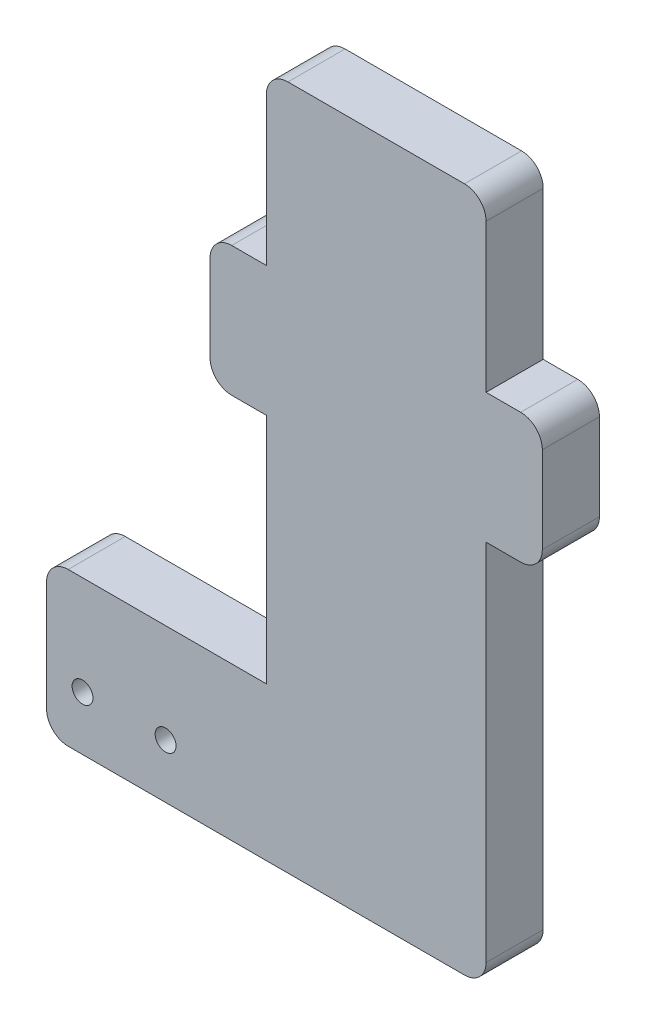
ISO-10303-21;
HEADER;
FILE_DESCRIPTION(('STEP AP214'),'2;1');
FILE_NAME('part.step','',(''),(''),'','','');
FILE_SCHEMA(('AUTOMOTIVE_DESIGN { 1 0 10303 214 1 1 1 1 }'));
ENDSEC;
DATA;
#1=APPLICATION_CONTEXT('core data for automotive mechanical design processes');
#2=APPLICATION_PROTOCOL_DEFINITION('international standard','automotive_design',2000,#1);
#3=PRODUCT_CONTEXT('',#1,'mechanical');
#4=PRODUCT('Part','Part','',(#3));
#5=PRODUCT_RELATED_PRODUCT_CATEGORY('part','',(#4));
#6=PRODUCT_DEFINITION_FORMATION('','',#4);
#7=PRODUCT_DEFINITION_CONTEXT('part definition',#1,'design');
#8=PRODUCT_DEFINITION('design','',#6,#7);
#9=PRODUCT_DEFINITION_SHAPE('','',#8);
#10=(LENGTH_UNIT() NAMED_UNIT(*) SI_UNIT(.MILLI.,.METRE.));
#11=(NAMED_UNIT(*) PLANE_ANGLE_UNIT() SI_UNIT($,.RADIAN.));
#12=(NAMED_UNIT(*) SI_UNIT($,.STERADIAN.) SOLID_ANGLE_UNIT());
#13=UNCERTAINTY_MEASURE_WITH_UNIT(LENGTH_MEASURE(1.E-05),#10,'distance_accuracy_value','');
#14=(GEOMETRIC_REPRESENTATION_CONTEXT(3) GLOBAL_UNCERTAINTY_ASSIGNED_CONTEXT((#13)) GLOBAL_UNIT_ASSIGNED_CONTEXT((#10,
#11,#12)) REPRESENTATION_CONTEXT('',''));
#15=CARTESIAN_POINT('',(0.,0.,0.));
#16=DIRECTION('',(0.,0.,1.));
#17=DIRECTION('',(1.,0.,0.));
#18=AXIS2_PLACEMENT_3D('',#15,#16,#17);
#19=CARTESIAN_POINT('',(-35.6,-45.95,6.6));
#20=DIRECTION('',(0.,0.,1.));
#21=DIRECTION('',(1.,0.,0.));
#22=AXIS2_PLACEMENT_3D('',#19,#20,#21);
#23=PLANE('',#22);
#24=CARTESIAN_POINT('',(-33.9438,-42.1983,6.6));
#25=DIRECTION('',(0.,0.,1.));
#26=DIRECTION('',(1.,0.,0.));
#27=AXIS2_PLACEMENT_3D('',#24,#25,#26);
#28=CIRCLE('',#27,1.20650000000003);
#29=CARTESIAN_POINT('',(-32.7373,-42.1983,6.6));
#30=VERTEX_POINT('',#29);
#31=EDGE_CURVE('E224',#30,#30,#28,.T.);
#32=ORIENTED_EDGE('',*,*,#31,.F.);
#33=EDGE_LOOP('',(#32));
#34=FACE_BOUND('',#33,.T.);
#35=CARTESIAN_POINT('',(-35.6,-45.95,6.6));
#36=DIRECTION('',(0.,0.,1.));
#37=DIRECTION('',(1.,0.,0.));
#38=AXIS2_PLACEMENT_3D('',#35,#36,#37);
#39=CIRCLE('',#38,2.50000000000001);
#40=CARTESIAN_POINT('',(-38.1,-45.95,6.6));
#41=VERTEX_POINT('',#40);
#42=CARTESIAN_POINT('',(-35.6,-48.45,6.6));
#43=VERTEX_POINT('',#42);
#44=EDGE_CURVE('E265',#41,#43,#39,.T.);
#45=ORIENTED_EDGE('',*,*,#44,.T.);
#46=DIRECTION('',(1.,0.,0.));
#47=VECTOR('',#46,1.);
#48=CARTESIAN_POINT('',(-35.6,-48.45,6.6));
#49=LINE('',#48,#47);
#50=CARTESIAN_POINT('',(10.2,-48.45,6.6));
#51=VERTEX_POINT('',#50);
#52=EDGE_CURVE('E138',#43,#51,#49,.T.);
#53=ORIENTED_EDGE('',*,*,#52,.T.);
#54=CARTESIAN_POINT('',(10.2,-45.95,6.6));
#55=DIRECTION('',(0.,0.,1.));
#56=DIRECTION('',(1.,0.,0.));
#57=AXIS2_PLACEMENT_3D('',#54,#55,#56);
#58=CIRCLE('',#57,2.50000000000002);
#59=CARTESIAN_POINT('',(12.7,-45.95,6.6));
#60=VERTEX_POINT('',#59);
#61=EDGE_CURVE('E325',#51,#60,#58,.T.);
#62=ORIENTED_EDGE('',*,*,#61,.T.);
#63=DIRECTION('',(0.,1.,0.));
#64=VECTOR('',#63,1.);
#65=CARTESIAN_POINT('',(12.7,-45.95,6.6));
#66=LINE('',#65,#64);
#67=CARTESIAN_POINT('',(12.7,-3.87,6.6));
#68=VERTEX_POINT('',#67);
#69=EDGE_CURVE('E344',#60,#68,#66,.T.);
#70=ORIENTED_EDGE('',*,*,#69,.T.);
#71=DIRECTION('',(1.,0.,0.));
#72=VECTOR('',#71,1.);
#73=CARTESIAN_POINT('',(16.7,-3.87,6.6));
#74=LINE('',#73,#72);
#75=CARTESIAN_POINT('',(16.7,-3.87,6.6));
#76=VERTEX_POINT('',#75);
#77=EDGE_CURVE('E341',#68,#76,#74,.T.);
#78=ORIENTED_EDGE('',*,*,#77,.T.);
#79=CARTESIAN_POINT('',(16.7,-1.37,6.6));
#80=DIRECTION('',(0.,0.,1.));
#81=DIRECTION('',(1.,0.,0.));
#82=AXIS2_PLACEMENT_3D('',#79,#80,#81);
#83=CIRCLE('',#82,2.5);
#84=CARTESIAN_POINT('',(19.2,-1.37,6.6));
#85=VERTEX_POINT('',#84);
#86=EDGE_CURVE('E343',#76,#85,#83,.T.);
#87=ORIENTED_EDGE('',*,*,#86,.T.);
#88=DIRECTION('',(0.,1.,0.));
#89=VECTOR('',#88,1.);
#90=CARTESIAN_POINT('',(19.2,8.63,6.6));
#91=LINE('',#90,#89);
#92=CARTESIAN_POINT('',(19.2,8.63,6.6));
#93=VERTEX_POINT('',#92);
#94=EDGE_CURVE('E346',#85,#93,#91,.T.);
#95=ORIENTED_EDGE('',*,*,#94,.T.);
#96=CARTESIAN_POINT('',(16.7,8.63,6.6));
#97=DIRECTION('',(0.,0.,1.));
#98=DIRECTION('',(1.,0.,0.));
#99=AXIS2_PLACEMENT_3D('',#96,#97,#98);
#100=CIRCLE('',#99,2.5);
#101=CARTESIAN_POINT('',(16.7,11.13,6.6));
#102=VERTEX_POINT('',#101);
#103=EDGE_CURVE('E352',#93,#102,#100,.T.);
#104=ORIENTED_EDGE('',*,*,#103,.T.);
#105=DIRECTION('',(-1.,0.,0.));
#106=VECTOR('',#105,1.);
#107=CARTESIAN_POINT('',(12.7,11.13,6.6));
#108=LINE('',#107,#106);
#109=CARTESIAN_POINT('',(12.7,11.13,6.6));
#110=VERTEX_POINT('',#109);
#111=EDGE_CURVE('E354',#102,#110,#108,.T.);
#112=ORIENTED_EDGE('',*,*,#111,.T.);
#113=DIRECTION('',(0.,1.,0.));
#114=VECTOR('',#113,1.);
#115=CARTESIAN_POINT('',(12.7,11.13,6.6));
#116=LINE('',#115,#114);
#117=CARTESIAN_POINT('',(12.7,28.25,6.6));
#118=VERTEX_POINT('',#117);
#119=EDGE_CURVE('E356',#110,#118,#116,.T.);
#120=ORIENTED_EDGE('',*,*,#119,.T.);
#121=CARTESIAN_POINT('',(10.2,28.25,6.6));
#122=DIRECTION('',(0.,0.,1.));
#123=DIRECTION('',(1.,0.,0.));
#124=AXIS2_PLACEMENT_3D('',#121,#122,#123);
#125=CIRCLE('',#124,2.50000000000001);
#126=CARTESIAN_POINT('',(10.2,30.75,6.6));
#127=VERTEX_POINT('',#126);
#128=EDGE_CURVE('E358',#118,#127,#125,.T.);
#129=ORIENTED_EDGE('',*,*,#128,.T.);
#130=DIRECTION('',(-1.,0.,0.));
#131=VECTOR('',#130,1.);
#132=CARTESIAN_POINT('',(10.2,30.75,6.6));
#133=LINE('',#132,#131);
#134=CARTESIAN_POINT('',(-10.2,30.75,6.6));
#135=VERTEX_POINT('',#134);
#136=EDGE_CURVE('E360',#127,#135,#133,.T.);
#137=ORIENTED_EDGE('',*,*,#136,.T.);
#138=CARTESIAN_POINT('',(-10.2,28.25,6.6));
#139=DIRECTION('',(0.,0.,1.));
#140=DIRECTION('',(1.,0.,0.));
#141=AXIS2_PLACEMENT_3D('',#138,#139,#140);
#142=CIRCLE('',#141,2.5);
#143=CARTESIAN_POINT('',(-12.7,28.25,6.6));
#144=VERTEX_POINT('',#143);
#145=EDGE_CURVE('E362',#135,#144,#142,.T.);
#146=ORIENTED_EDGE('',*,*,#145,.T.);
#147=DIRECTION('',(0.,-1.,0.));
#148=VECTOR('',#147,1.);
#149=CARTESIAN_POINT('',(-12.7,28.25,6.6));
#150=LINE('',#149,#148);
#151=CARTESIAN_POINT('',(-12.7,11.13,6.6));
#152=VERTEX_POINT('',#151);
#153=EDGE_CURVE('E364',#144,#152,#150,.T.);
#154=ORIENTED_EDGE('',*,*,#153,.T.);
#155=DIRECTION('',(-1.,0.,0.));
#156=VECTOR('',#155,1.);
#157=CARTESIAN_POINT('',(-12.7,11.13,6.6));
#158=LINE('',#157,#156);
#159=CARTESIAN_POINT('',(-16.7,11.13,6.6));
#160=VERTEX_POINT('',#159);
#161=EDGE_CURVE('E366',#152,#160,#158,.T.);
#162=ORIENTED_EDGE('',*,*,#161,.T.);
#163=CARTESIAN_POINT('',(-16.7,8.63,6.6));
#164=DIRECTION('',(0.,0.,1.));
#165=DIRECTION('',(1.,0.,0.));
#166=AXIS2_PLACEMENT_3D('',#163,#164,#165);
#167=CIRCLE('',#166,2.5);
#168=CARTESIAN_POINT('',(-19.2,8.63,6.6));
#169=VERTEX_POINT('',#168);
#170=EDGE_CURVE('E368',#160,#169,#167,.T.);
#171=ORIENTED_EDGE('',*,*,#170,.T.);
#172=DIRECTION('',(0.,-1.,0.));
#173=VECTOR('',#172,1.);
#174=CARTESIAN_POINT('',(-19.2,8.63,6.6));
#175=LINE('',#174,#173);
#176=CARTESIAN_POINT('',(-19.2,-1.37,6.6));
#177=VERTEX_POINT('',#176);
#178=EDGE_CURVE('E370',#169,#177,#175,.T.);
#179=ORIENTED_EDGE('',*,*,#178,.T.);
#180=CARTESIAN_POINT('',(-16.7,-1.36999999999999,6.6));
#181=DIRECTION('',(0.,0.,1.));
#182=DIRECTION('',(1.,0.,0.));
#183=AXIS2_PLACEMENT_3D('',#180,#181,#182);
#184=CIRCLE('',#183,2.50000000000001);
#185=CARTESIAN_POINT('',(-16.7,-3.87,6.6));
#186=VERTEX_POINT('',#185);
#187=EDGE_CURVE('E372',#177,#186,#184,.T.);
#188=ORIENTED_EDGE('',*,*,#187,.T.);
#189=DIRECTION('',(1.,0.,0.));
#190=VECTOR('',#189,1.);
#191=CARTESIAN_POINT('',(-16.7,-3.87,6.6));
#192=LINE('',#191,#190);
#193=CARTESIAN_POINT('',(-12.7,-3.87,6.6));
#194=VERTEX_POINT('',#193);
#195=EDGE_CURVE('E374',#186,#194,#192,.T.);
#196=ORIENTED_EDGE('',*,*,#195,.T.);
#197=DIRECTION('',(0.,-1.,0.));
#198=VECTOR('',#197,1.);
#199=CARTESIAN_POINT('',(-12.7,-3.87,6.6));
#200=LINE('',#199,#198);
#201=CARTESIAN_POINT('',(-12.7,-30.75,6.6));
#202=VERTEX_POINT('',#201);
#203=EDGE_CURVE('E202',#194,#202,#200,.T.);
#204=ORIENTED_EDGE('',*,*,#203,.T.);
#205=DIRECTION('',(-1.,0.,0.));
#206=VECTOR('',#205,1.);
#207=CARTESIAN_POINT('',(-12.7,-30.75,6.6));
#208=LINE('',#207,#206);
#209=CARTESIAN_POINT('',(-35.6,-30.75,6.6));
#210=VERTEX_POINT('',#209);
#211=EDGE_CURVE('E196',#202,#210,#208,.T.);
#212=ORIENTED_EDGE('',*,*,#211,.T.);
#213=CARTESIAN_POINT('',(-35.6,-33.25,6.6));
#214=DIRECTION('',(0.,0.,1.));
#215=DIRECTION('',(1.,0.,0.));
#216=AXIS2_PLACEMENT_3D('',#213,#214,#215);
#217=CIRCLE('',#216,2.5);
#218=CARTESIAN_POINT('',(-38.1,-33.25,6.6));
#219=VERTEX_POINT('',#218);
#220=EDGE_CURVE('E200',#210,#219,#217,.T.);
#221=ORIENTED_EDGE('',*,*,#220,.T.);
#222=DIRECTION('',(0.,-1.,0.));
#223=VECTOR('',#222,1.);
#224=CARTESIAN_POINT('',(-38.1,-33.25,6.6));
#225=LINE('',#224,#223);
#226=EDGE_CURVE('E50',#219,#41,#225,.T.);
#227=ORIENTED_EDGE('',*,*,#226,.T.);
#228=EDGE_LOOP('',(#45,#53,#62,#70,#78,#87,#95,#104,#112,#120,#129,#137,#146,#154,#162,#171,
#179,#188,#196,#204,#212,#221,#227));
#229=FACE_BOUND('',#228,.T.);
#230=CARTESIAN_POINT('',(-24.3426,-42.1983,6.6));
#231=DIRECTION('',(0.,0.,1.));
#232=DIRECTION('',(1.,0.,0.));
#233=AXIS2_PLACEMENT_3D('',#230,#231,#232);
#234=CIRCLE('',#233,1.20650000000002);
#235=CARTESIAN_POINT('',(-23.1361,-42.1983,6.6));
#236=VERTEX_POINT('',#235);
#237=EDGE_CURVE('E417',#236,#236,#234,.T.);
#238=ORIENTED_EDGE('',*,*,#237,.F.);
#239=EDGE_LOOP('',(#238));
#240=FACE_BOUND('',#239,.T.);
#241=ADVANCED_FACE('F33',(#34,#229,#240),#23,.T.);
#242=CARTESIAN_POINT('',(-35.6,-45.95,0.));
#243=DIRECTION('',(0.,0.,1.));
#244=DIRECTION('',(1.,0.,0.));
#245=AXIS2_PLACEMENT_3D('',#242,#243,#244);
#246=PLANE('',#245);
#247=CARTESIAN_POINT('',(-33.9438,-42.1983,0.));
#248=DIRECTION('',(0.,0.,1.));
#249=DIRECTION('',(1.,0.,0.));
#250=AXIS2_PLACEMENT_3D('',#247,#248,#249);
#251=CIRCLE('',#250,1.20650000000003);
#252=CARTESIAN_POINT('',(-32.7373,-42.1983,0.));
#253=VERTEX_POINT('',#252);
#254=EDGE_CURVE('E422',#253,#253,#251,.T.);
#255=ORIENTED_EDGE('',*,*,#254,.T.);
#256=EDGE_LOOP('',(#255));
#257=FACE_BOUND('',#256,.T.);
#258=CARTESIAN_POINT('',(-35.6,-45.95,0.));
#259=DIRECTION('',(0.,0.,1.));
#260=DIRECTION('',(1.,0.,0.));
#261=AXIS2_PLACEMENT_3D('',#258,#259,#260);
#262=CIRCLE('',#261,2.50000000000001);
#263=CARTESIAN_POINT('',(-38.1,-45.95,0.));
#264=VERTEX_POINT('',#263);
#265=CARTESIAN_POINT('',(-35.6,-48.45,0.));
#266=VERTEX_POINT('',#265);
#267=EDGE_CURVE('E220',#264,#266,#262,.T.);
#268=ORIENTED_EDGE('',*,*,#267,.F.);
#269=DIRECTION('',(0.,-1.,0.));
#270=VECTOR('',#269,1.);
#271=CARTESIAN_POINT('',(-38.1,-33.25,0.));
#272=LINE('',#271,#270);
#273=CARTESIAN_POINT('',(-38.1,-33.25,0.));
#274=VERTEX_POINT('',#273);
#275=EDGE_CURVE('E130',#274,#264,#272,.T.);
#276=ORIENTED_EDGE('',*,*,#275,.F.);
#277=CARTESIAN_POINT('',(-35.6,-33.25,0.));
#278=DIRECTION('',(0.,0.,1.));
#279=DIRECTION('',(1.,0.,0.));
#280=AXIS2_PLACEMENT_3D('',#277,#278,#279);
#281=CIRCLE('',#280,2.5);
#282=CARTESIAN_POINT('',(-35.6,-30.75,0.));
#283=VERTEX_POINT('',#282);
#284=EDGE_CURVE('E124',#283,#274,#281,.T.);
#285=ORIENTED_EDGE('',*,*,#284,.F.);
#286=DIRECTION('',(-1.,0.,0.));
#287=VECTOR('',#286,1.);
#288=CARTESIAN_POINT('',(-12.7,-30.75,0.));
#289=LINE('',#288,#287);
#290=CARTESIAN_POINT('',(-12.7,-30.75,0.));
#291=VERTEX_POINT('',#290);
#292=EDGE_CURVE('E210',#291,#283,#289,.T.);
#293=ORIENTED_EDGE('',*,*,#292,.F.);
#294=DIRECTION('',(0.,-1.,0.));
#295=VECTOR('',#294,1.);
#296=CARTESIAN_POINT('',(-12.7,-3.87,0.));
#297=LINE('',#296,#295);
#298=CARTESIAN_POINT('',(-12.7,-3.87,0.));
#299=VERTEX_POINT('',#298);
#300=EDGE_CURVE('E260',#299,#291,#297,.T.);
#301=ORIENTED_EDGE('',*,*,#300,.F.);
#302=DIRECTION('',(1.,0.,0.));
#303=VECTOR('',#302,1.);
#304=CARTESIAN_POINT('',(-16.7,-3.87,0.));
#305=LINE('',#304,#303);
#306=CARTESIAN_POINT('',(-16.7,-3.87,0.));
#307=VERTEX_POINT('',#306);
#308=EDGE_CURVE('E258',#307,#299,#305,.T.);
#309=ORIENTED_EDGE('',*,*,#308,.F.);
#310=CARTESIAN_POINT('',(-16.7,-1.36999999999999,0.));
#311=DIRECTION('',(0.,0.,1.));
#312=DIRECTION('',(1.,0.,0.));
#313=AXIS2_PLACEMENT_3D('',#310,#311,#312);
#314=CIRCLE('',#313,2.50000000000001);
#315=CARTESIAN_POINT('',(-19.2,-1.37,0.));
#316=VERTEX_POINT('',#315);
#317=EDGE_CURVE('E256',#316,#307,#314,.T.);
#318=ORIENTED_EDGE('',*,*,#317,.F.);
#319=DIRECTION('',(0.,-1.,0.));
#320=VECTOR('',#319,1.);
#321=CARTESIAN_POINT('',(-19.2,8.63,0.));
#322=LINE('',#321,#320);
#323=CARTESIAN_POINT('',(-19.2,8.63,0.));
#324=VERTEX_POINT('',#323);
#325=EDGE_CURVE('E254',#324,#316,#322,.T.);
#326=ORIENTED_EDGE('',*,*,#325,.F.);
#327=CARTESIAN_POINT('',(-16.7,8.63,0.));
#328=DIRECTION('',(0.,0.,1.));
#329=DIRECTION('',(1.,0.,0.));
#330=AXIS2_PLACEMENT_3D('',#327,#328,#329);
#331=CIRCLE('',#330,2.5);
#332=CARTESIAN_POINT('',(-16.7,11.13,0.));
#333=VERTEX_POINT('',#332);
#334=EDGE_CURVE('E252',#333,#324,#331,.T.);
#335=ORIENTED_EDGE('',*,*,#334,.F.);
#336=DIRECTION('',(-1.,0.,0.));
#337=VECTOR('',#336,1.);
#338=CARTESIAN_POINT('',(-12.7,11.13,0.));
#339=LINE('',#338,#337);
#340=CARTESIAN_POINT('',(-12.7,11.13,0.));
#341=VERTEX_POINT('',#340);
#342=EDGE_CURVE('E250',#341,#333,#339,.T.);
#343=ORIENTED_EDGE('',*,*,#342,.F.);
#344=DIRECTION('',(0.,-1.,0.));
#345=VECTOR('',#344,1.);
#346=CARTESIAN_POINT('',(-12.7,28.25,0.));
#347=LINE('',#346,#345);
#348=CARTESIAN_POINT('',(-12.7,28.25,0.));
#349=VERTEX_POINT('',#348);
#350=EDGE_CURVE('E248',#349,#341,#347,.T.);
#351=ORIENTED_EDGE('',*,*,#350,.F.);
#352=CARTESIAN_POINT('',(-10.2,28.25,0.));
#353=DIRECTION('',(0.,0.,1.));
#354=DIRECTION('',(1.,0.,0.));
#355=AXIS2_PLACEMENT_3D('',#352,#353,#354);
#356=CIRCLE('',#355,2.5);
#357=CARTESIAN_POINT('',(-10.2,30.75,0.));
#358=VERTEX_POINT('',#357);
#359=EDGE_CURVE('E246',#358,#349,#356,.T.);
#360=ORIENTED_EDGE('',*,*,#359,.F.);
#361=DIRECTION('',(-1.,0.,0.));
#362=VECTOR('',#361,1.);
#363=CARTESIAN_POINT('',(10.2,30.75,0.));
#364=LINE('',#363,#362);
#365=CARTESIAN_POINT('',(10.2,30.75,0.));
#366=VERTEX_POINT('',#365);
#367=EDGE_CURVE('E244',#366,#358,#364,.T.);
#368=ORIENTED_EDGE('',*,*,#367,.F.);
#369=CARTESIAN_POINT('',(10.2,28.25,0.));
#370=DIRECTION('',(0.,0.,1.));
#371=DIRECTION('',(1.,0.,0.));
#372=AXIS2_PLACEMENT_3D('',#369,#370,#371);
#373=CIRCLE('',#372,2.50000000000001);
#374=CARTESIAN_POINT('',(12.7,28.25,0.));
#375=VERTEX_POINT('',#374);
#376=EDGE_CURVE('E242',#375,#366,#373,.T.);
#377=ORIENTED_EDGE('',*,*,#376,.F.);
#378=DIRECTION('',(0.,1.,0.));
#379=VECTOR('',#378,1.);
#380=CARTESIAN_POINT('',(12.7,11.13,0.));
#381=LINE('',#380,#379);
#382=CARTESIAN_POINT('',(12.7,11.13,0.));
#383=VERTEX_POINT('',#382);
#384=EDGE_CURVE('E240',#383,#375,#381,.T.);
#385=ORIENTED_EDGE('',*,*,#384,.F.);
#386=DIRECTION('',(-1.,0.,0.));
#387=VECTOR('',#386,1.);
#388=CARTESIAN_POINT('',(12.7,11.13,0.));
#389=LINE('',#388,#387);
#390=CARTESIAN_POINT('',(16.7,11.13,0.));
#391=VERTEX_POINT('',#390);
#392=EDGE_CURVE('E238',#391,#383,#389,.T.);
#393=ORIENTED_EDGE('',*,*,#392,.F.);
#394=CARTESIAN_POINT('',(16.7,8.63,0.));
#395=DIRECTION('',(0.,0.,1.));
#396=DIRECTION('',(1.,0.,0.));
#397=AXIS2_PLACEMENT_3D('',#394,#395,#396);
#398=CIRCLE('',#397,2.5);
#399=CARTESIAN_POINT('',(19.2,8.63,0.));
#400=VERTEX_POINT('',#399);
#401=EDGE_CURVE('E236',#400,#391,#398,.T.);
#402=ORIENTED_EDGE('',*,*,#401,.F.);
#403=DIRECTION('',(0.,1.,0.));
#404=VECTOR('',#403,1.);
#405=CARTESIAN_POINT('',(19.2,8.63,0.));
#406=LINE('',#405,#404);
#407=CARTESIAN_POINT('',(19.2,-1.37,0.));
#408=VERTEX_POINT('',#407);
#409=EDGE_CURVE('E234',#408,#400,#406,.T.);
#410=ORIENTED_EDGE('',*,*,#409,.F.);
#411=CARTESIAN_POINT('',(16.7,-1.37,0.));
#412=DIRECTION('',(0.,0.,1.));
#413=DIRECTION('',(1.,0.,0.));
#414=AXIS2_PLACEMENT_3D('',#411,#412,#413);
#415=CIRCLE('',#414,2.5);
#416=CARTESIAN_POINT('',(16.7,-3.87,0.));
#417=VERTEX_POINT('',#416);
#418=EDGE_CURVE('E232',#417,#408,#415,.T.);
#419=ORIENTED_EDGE('',*,*,#418,.F.);
#420=DIRECTION('',(1.,0.,0.));
#421=VECTOR('',#420,1.);
#422=CARTESIAN_POINT('',(16.7,-3.87,0.));
#423=LINE('',#422,#421);
#424=CARTESIAN_POINT('',(12.7,-3.87,0.));
#425=VERTEX_POINT('',#424);
#426=EDGE_CURVE('E230',#425,#417,#423,.T.);
#427=ORIENTED_EDGE('',*,*,#426,.F.);
#428=DIRECTION('',(0.,1.,0.));
#429=VECTOR('',#428,1.);
#430=CARTESIAN_POINT('',(12.7,-45.95,0.));
#431=LINE('',#430,#429);
#432=CARTESIAN_POINT('',(12.7,-45.95,0.));
#433=VERTEX_POINT('',#432);
#434=EDGE_CURVE('E228',#433,#425,#431,.T.);
#435=ORIENTED_EDGE('',*,*,#434,.F.);
#436=CARTESIAN_POINT('',(10.2,-45.95,0.));
#437=DIRECTION('',(0.,0.,1.));
#438=DIRECTION('',(1.,0.,0.));
#439=AXIS2_PLACEMENT_3D('',#436,#437,#438);
#440=CIRCLE('',#439,2.50000000000002);
#441=CARTESIAN_POINT('',(10.2,-48.45,0.));
#442=VERTEX_POINT('',#441);
#443=EDGE_CURVE('E226',#442,#433,#440,.T.);
#444=ORIENTED_EDGE('',*,*,#443,.F.);
#445=DIRECTION('',(1.,0.,0.));
#446=VECTOR('',#445,1.);
#447=CARTESIAN_POINT('',(-35.6,-48.45,0.));
#448=LINE('',#447,#446);
#449=EDGE_CURVE('E223',#266,#442,#448,.T.);
#450=ORIENTED_EDGE('',*,*,#449,.F.);
#451=EDGE_LOOP('',(#268,#276,#285,#293,#301,#309,#318,#326,#335,#343,#351,#360,#368,#377,#385,
#393,#402,#410,#419,#427,#435,#444,#450));
#452=FACE_BOUND('',#451,.T.);
#453=CARTESIAN_POINT('',(-24.3426,-42.1983,0.));
#454=DIRECTION('',(0.,0.,1.));
#455=DIRECTION('',(1.,0.,0.));
#456=AXIS2_PLACEMENT_3D('',#453,#454,#455);
#457=CIRCLE('',#456,1.20650000000002);
#458=CARTESIAN_POINT('',(-23.1361,-42.1983,0.));
#459=VERTEX_POINT('',#458);
#460=EDGE_CURVE('E420',#459,#459,#457,.T.);
#461=ORIENTED_EDGE('',*,*,#460,.T.);
#462=EDGE_LOOP('',(#461));
#463=FACE_BOUND('',#462,.T.);
#464=ADVANCED_FACE('F329',(#257,#452,#463),#246,.F.);
#465=CARTESIAN_POINT('',(-35.6,-45.95,6.6));
#466=DIRECTION('',(0.,0.,-1.));
#467=DIRECTION('',(-1.,0.,0.));
#468=AXIS2_PLACEMENT_3D('',#465,#466,#467);
#469=CYLINDRICAL_SURFACE('',#468,2.50000000000001);
#470=ORIENTED_EDGE('',*,*,#267,.T.);
#471=DIRECTION('',(0.,0.,-1.));
#472=VECTOR('',#471,1.);
#473=CARTESIAN_POINT('',(-35.6,-48.45,6.6));
#474=LINE('',#473,#472);
#475=EDGE_CURVE('E11',#43,#266,#474,.T.);
#476=ORIENTED_EDGE('',*,*,#475,.F.);
#477=ORIENTED_EDGE('',*,*,#44,.F.);
#478=DIRECTION('',(0.,0.,-1.));
#479=VECTOR('',#478,1.);
#480=CARTESIAN_POINT('',(-38.1,-45.95,6.6));
#481=LINE('',#480,#479);
#482=EDGE_CURVE('E216',#41,#264,#481,.T.);
#483=ORIENTED_EDGE('',*,*,#482,.T.);
#484=EDGE_LOOP('',(#470,#476,#477,#483));
#485=FACE_BOUND('',#484,.T.);
#486=ADVANCED_FACE('F35',(#485),#469,.T.);
#487=CARTESIAN_POINT('',(-35.6,-48.45,6.6));
#488=DIRECTION('',(0.,1.,0.));
#489=DIRECTION('',(0.,0.,1.));
#490=AXIS2_PLACEMENT_3D('',#487,#488,#489);
#491=PLANE('',#490);
#492=ORIENTED_EDGE('',*,*,#449,.T.);
#493=DIRECTION('',(0.,0.,-1.));
#494=VECTOR('',#493,1.);
#495=CARTESIAN_POINT('',(10.2,-48.45,6.6));
#496=LINE('',#495,#494);
#497=EDGE_CURVE('E42',#51,#442,#496,.T.);
#498=ORIENTED_EDGE('',*,*,#497,.F.);
#499=ORIENTED_EDGE('',*,*,#52,.F.);
#500=ORIENTED_EDGE('',*,*,#475,.T.);
#501=EDGE_LOOP('',(#492,#498,#499,#500));
#502=FACE_BOUND('',#501,.T.);
#503=ADVANCED_FACE('F625',(#502),#491,.F.);
#504=CARTESIAN_POINT('',(10.2,-45.95,6.6));
#505=DIRECTION('',(0.,0.,-1.));
#506=DIRECTION('',(-1.,0.,0.));
#507=AXIS2_PLACEMENT_3D('',#504,#505,#506);
#508=CYLINDRICAL_SURFACE('',#507,2.50000000000002);
#509=ORIENTED_EDGE('',*,*,#443,.T.);
#510=DIRECTION('',(0.,0.,-1.));
#511=VECTOR('',#510,1.);
#512=CARTESIAN_POINT('',(12.7,-45.95,6.6));
#513=LINE('',#512,#511);
#514=EDGE_CURVE('E317',#60,#433,#513,.T.);
#515=ORIENTED_EDGE('',*,*,#514,.F.);
#516=ORIENTED_EDGE('',*,*,#61,.F.);
#517=ORIENTED_EDGE('',*,*,#497,.T.);
#518=EDGE_LOOP('',(#509,#515,#516,#517));
#519=FACE_BOUND('',#518,.T.);
#520=ADVANCED_FACE('F323',(#519),#508,.T.);
#521=CARTESIAN_POINT('',(12.7,-45.95,6.6));
#522=DIRECTION('',(-1.,0.,0.));
#523=DIRECTION('',(0.,0.,1.));
#524=AXIS2_PLACEMENT_3D('',#521,#522,#523);
#525=PLANE('',#524);
#526=ORIENTED_EDGE('',*,*,#434,.T.);
#527=DIRECTION('',(0.,0.,-1.));
#528=VECTOR('',#527,1.);
#529=CARTESIAN_POINT('',(12.7,-3.87,6.6));
#530=LINE('',#529,#528);
#531=EDGE_CURVE('E314',#68,#425,#530,.T.);
#532=ORIENTED_EDGE('',*,*,#531,.F.);
#533=ORIENTED_EDGE('',*,*,#69,.F.);
#534=ORIENTED_EDGE('',*,*,#514,.T.);
#535=EDGE_LOOP('',(#526,#532,#533,#534));
#536=FACE_BOUND('',#535,.T.);
#537=ADVANCED_FACE('F335',(#536),#525,.F.);
#538=CARTESIAN_POINT('',(16.7,-3.87,6.6));
#539=DIRECTION('',(0.,1.,0.));
#540=DIRECTION('',(0.,0.,1.));
#541=AXIS2_PLACEMENT_3D('',#538,#539,#540);
#542=PLANE('',#541);
#543=ORIENTED_EDGE('',*,*,#426,.T.);
#544=DIRECTION('',(0.,0.,-1.));
#545=VECTOR('',#544,1.);
#546=CARTESIAN_POINT('',(16.7,-3.87,6.6));
#547=LINE('',#546,#545);
#548=EDGE_CURVE('E311',#76,#417,#547,.T.);
#549=ORIENTED_EDGE('',*,*,#548,.F.);
#550=ORIENTED_EDGE('',*,*,#77,.F.);
#551=ORIENTED_EDGE('',*,*,#531,.T.);
#552=EDGE_LOOP('',(#543,#549,#550,#551));
#553=FACE_BOUND('',#552,.T.);
#554=ADVANCED_FACE('F339',(#553),#542,.F.);
#555=CARTESIAN_POINT('',(16.7,-1.37,6.6));
#556=DIRECTION('',(0.,0.,-1.));
#557=DIRECTION('',(-1.,0.,0.));
#558=AXIS2_PLACEMENT_3D('',#555,#556,#557);
#559=CYLINDRICAL_SURFACE('',#558,2.5);
#560=ORIENTED_EDGE('',*,*,#418,.T.);
#561=DIRECTION('',(0.,0.,-1.));
#562=VECTOR('',#561,1.);
#563=CARTESIAN_POINT('',(19.2,-1.37,6.6));
#564=LINE('',#563,#562);
#565=EDGE_CURVE('E308',#85,#408,#564,.T.);
#566=ORIENTED_EDGE('',*,*,#565,.F.);
#567=ORIENTED_EDGE('',*,*,#86,.F.);
#568=ORIENTED_EDGE('',*,*,#548,.T.);
#569=EDGE_LOOP('',(#560,#566,#567,#568));
#570=FACE_BOUND('',#569,.T.);
#571=ADVANCED_FACE('F590',(#570),#559,.T.);
#572=CARTESIAN_POINT('',(19.2,8.63,6.6));
#573=DIRECTION('',(-1.,0.,0.));
#574=DIRECTION('',(0.,0.,1.));
#575=AXIS2_PLACEMENT_3D('',#572,#573,#574);
#576=PLANE('',#575);
#577=ORIENTED_EDGE('',*,*,#409,.T.);
#578=DIRECTION('',(0.,0.,-1.));
#579=VECTOR('',#578,1.);
#580=CARTESIAN_POINT('',(19.2,8.63,6.6));
#581=LINE('',#580,#579);
#582=EDGE_CURVE('E305',#93,#400,#581,.T.);
#583=ORIENTED_EDGE('',*,*,#582,.F.);
#584=ORIENTED_EDGE('',*,*,#94,.F.);
#585=ORIENTED_EDGE('',*,*,#565,.T.);
#586=EDGE_LOOP('',(#577,#583,#584,#585));
#587=FACE_BOUND('',#586,.T.);
#588=ADVANCED_FACE('F580',(#587),#576,.F.);
#589=CARTESIAN_POINT('',(16.7,8.63,6.6));
#590=DIRECTION('',(0.,0.,-1.));
#591=DIRECTION('',(-1.,0.,0.));
#592=AXIS2_PLACEMENT_3D('',#589,#590,#591);
#593=CYLINDRICAL_SURFACE('',#592,2.5);
#594=ORIENTED_EDGE('',*,*,#401,.T.);
#595=DIRECTION('',(0.,0.,-1.));
#596=VECTOR('',#595,1.);
#597=CARTESIAN_POINT('',(16.7,11.13,6.6));
#598=LINE('',#597,#596);
#599=EDGE_CURVE('E302',#102,#391,#598,.T.);
#600=ORIENTED_EDGE('',*,*,#599,.F.);
#601=ORIENTED_EDGE('',*,*,#103,.F.);
#602=ORIENTED_EDGE('',*,*,#582,.T.);
#603=EDGE_LOOP('',(#594,#600,#601,#602));
#604=FACE_BOUND('',#603,.T.);
#605=ADVANCED_FACE('F570',(#604),#593,.T.);
#606=CARTESIAN_POINT('',(12.7,11.13,6.6));
#607=DIRECTION('',(0.,-1.,0.));
#608=DIRECTION('',(0.,0.,-1.));
#609=AXIS2_PLACEMENT_3D('',#606,#607,#608);
#610=PLANE('',#609);
#611=ORIENTED_EDGE('',*,*,#392,.T.);
#612=DIRECTION('',(0.,0.,-1.));
#613=VECTOR('',#612,1.);
#614=CARTESIAN_POINT('',(12.7,11.13,6.6));
#615=LINE('',#614,#613);
#616=EDGE_CURVE('E299',#110,#383,#615,.T.);
#617=ORIENTED_EDGE('',*,*,#616,.F.);
#618=ORIENTED_EDGE('',*,*,#111,.F.);
#619=ORIENTED_EDGE('',*,*,#599,.T.);
#620=EDGE_LOOP('',(#611,#617,#618,#619));
#621=FACE_BOUND('',#620,.T.);
#622=ADVANCED_FACE('F560',(#621),#610,.F.);
#623=CARTESIAN_POINT('',(12.7,11.13,6.6));
#624=DIRECTION('',(-1.,0.,0.));
#625=DIRECTION('',(0.,0.,1.));
#626=AXIS2_PLACEMENT_3D('',#623,#624,#625);
#627=PLANE('',#626);
#628=ORIENTED_EDGE('',*,*,#384,.T.);
#629=DIRECTION('',(0.,0.,-1.));
#630=VECTOR('',#629,1.);
#631=CARTESIAN_POINT('',(12.7,28.25,6.6));
#632=LINE('',#631,#630);
#633=EDGE_CURVE('E296',#118,#375,#632,.T.);
#634=ORIENTED_EDGE('',*,*,#633,.F.);
#635=ORIENTED_EDGE('',*,*,#119,.F.);
#636=ORIENTED_EDGE('',*,*,#616,.T.);
#637=EDGE_LOOP('',(#628,#634,#635,#636));
#638=FACE_BOUND('',#637,.T.);
#639=ADVANCED_FACE('F550',(#638),#627,.F.);
#640=CARTESIAN_POINT('',(10.2,28.25,6.6));
#641=DIRECTION('',(0.,0.,-1.));
#642=DIRECTION('',(-1.,0.,0.));
#643=AXIS2_PLACEMENT_3D('',#640,#641,#642);
#644=CYLINDRICAL_SURFACE('',#643,2.50000000000001);
#645=ORIENTED_EDGE('',*,*,#376,.T.);
#646=DIRECTION('',(0.,0.,-1.));
#647=VECTOR('',#646,1.);
#648=CARTESIAN_POINT('',(10.2,30.75,6.6));
#649=LINE('',#648,#647);
#650=EDGE_CURVE('E293',#127,#366,#649,.T.);
#651=ORIENTED_EDGE('',*,*,#650,.F.);
#652=ORIENTED_EDGE('',*,*,#128,.F.);
#653=ORIENTED_EDGE('',*,*,#633,.T.);
#654=EDGE_LOOP('',(#645,#651,#652,#653));
#655=FACE_BOUND('',#654,.T.);
#656=ADVANCED_FACE('F540',(#655),#644,.T.);
#657=CARTESIAN_POINT('',(10.2,30.75,6.6));
#658=DIRECTION('',(0.,-1.,0.));
#659=DIRECTION('',(0.,0.,-1.));
#660=AXIS2_PLACEMENT_3D('',#657,#658,#659);
#661=PLANE('',#660);
#662=ORIENTED_EDGE('',*,*,#367,.T.);
#663=DIRECTION('',(0.,0.,-1.));
#664=VECTOR('',#663,1.);
#665=CARTESIAN_POINT('',(-10.2,30.75,6.6));
#666=LINE('',#665,#664);
#667=EDGE_CURVE('E290',#135,#358,#666,.T.);
#668=ORIENTED_EDGE('',*,*,#667,.F.);
#669=ORIENTED_EDGE('',*,*,#136,.F.);
#670=ORIENTED_EDGE('',*,*,#650,.T.);
#671=EDGE_LOOP('',(#662,#668,#669,#670));
#672=FACE_BOUND('',#671,.T.);
#673=ADVANCED_FACE('F530',(#672),#661,.F.);
#674=CARTESIAN_POINT('',(-10.2,28.25,6.6));
#675=DIRECTION('',(0.,0.,-1.));
#676=DIRECTION('',(-1.,0.,0.));
#677=AXIS2_PLACEMENT_3D('',#674,#675,#676);
#678=CYLINDRICAL_SURFACE('',#677,2.5);
#679=ORIENTED_EDGE('',*,*,#359,.T.);
#680=DIRECTION('',(0.,0.,-1.));
#681=VECTOR('',#680,1.);
#682=CARTESIAN_POINT('',(-12.7,28.25,6.6));
#683=LINE('',#682,#681);
#684=EDGE_CURVE('E287',#144,#349,#683,.T.);
#685=ORIENTED_EDGE('',*,*,#684,.F.);
#686=ORIENTED_EDGE('',*,*,#145,.F.);
#687=ORIENTED_EDGE('',*,*,#667,.T.);
#688=EDGE_LOOP('',(#679,#685,#686,#687));
#689=FACE_BOUND('',#688,.T.);
#690=ADVANCED_FACE('F520',(#689),#678,.T.);
#691=CARTESIAN_POINT('',(-12.7,28.25,6.6));
#692=DIRECTION('',(1.,0.,0.));
#693=DIRECTION('',(0.,0.,-1.));
#694=AXIS2_PLACEMENT_3D('',#691,#692,#693);
#695=PLANE('',#694);
#696=ORIENTED_EDGE('',*,*,#350,.T.);
#697=DIRECTION('',(0.,0.,-1.));
#698=VECTOR('',#697,1.);
#699=CARTESIAN_POINT('',(-12.7,11.13,6.6));
#700=LINE('',#699,#698);
#701=EDGE_CURVE('E284',#152,#341,#700,.T.);
#702=ORIENTED_EDGE('',*,*,#701,.F.);
#703=ORIENTED_EDGE('',*,*,#153,.F.);
#704=ORIENTED_EDGE('',*,*,#684,.T.);
#705=EDGE_LOOP('',(#696,#702,#703,#704));
#706=FACE_BOUND('',#705,.T.);
#707=ADVANCED_FACE('F510',(#706),#695,.F.);
#708=CARTESIAN_POINT('',(-12.7,11.13,6.6));
#709=DIRECTION('',(0.,-1.,0.));
#710=DIRECTION('',(0.,0.,-1.));
#711=AXIS2_PLACEMENT_3D('',#708,#709,#710);
#712=PLANE('',#711);
#713=ORIENTED_EDGE('',*,*,#342,.T.);
#714=DIRECTION('',(0.,0.,-1.));
#715=VECTOR('',#714,1.);
#716=CARTESIAN_POINT('',(-16.7,11.13,6.6));
#717=LINE('',#716,#715);
#718=EDGE_CURVE('E281',#160,#333,#717,.T.);
#719=ORIENTED_EDGE('',*,*,#718,.F.);
#720=ORIENTED_EDGE('',*,*,#161,.F.);
#721=ORIENTED_EDGE('',*,*,#701,.T.);
#722=EDGE_LOOP('',(#713,#719,#720,#721));
#723=FACE_BOUND('',#722,.T.);
#724=ADVANCED_FACE('F500',(#723),#712,.F.);
#725=CARTESIAN_POINT('',(-16.7,8.63,6.6));
#726=DIRECTION('',(0.,0.,-1.));
#727=DIRECTION('',(-1.,0.,0.));
#728=AXIS2_PLACEMENT_3D('',#725,#726,#727);
#729=CYLINDRICAL_SURFACE('',#728,2.5);
#730=ORIENTED_EDGE('',*,*,#334,.T.);
#731=DIRECTION('',(0.,0.,-1.));
#732=VECTOR('',#731,1.);
#733=CARTESIAN_POINT('',(-19.2,8.63,6.6));
#734=LINE('',#733,#732);
#735=EDGE_CURVE('E278',#169,#324,#734,.T.);
#736=ORIENTED_EDGE('',*,*,#735,.F.);
#737=ORIENTED_EDGE('',*,*,#170,.F.);
#738=ORIENTED_EDGE('',*,*,#718,.T.);
#739=EDGE_LOOP('',(#730,#736,#737,#738));
#740=FACE_BOUND('',#739,.T.);
#741=ADVANCED_FACE('F490',(#740),#729,.T.);
#742=CARTESIAN_POINT('',(-19.2,8.63,6.6));
#743=DIRECTION('',(1.,0.,0.));
#744=DIRECTION('',(0.,0.,-1.));
#745=AXIS2_PLACEMENT_3D('',#742,#743,#744);
#746=PLANE('',#745);
#747=ORIENTED_EDGE('',*,*,#325,.T.);
#748=DIRECTION('',(0.,0.,-1.));
#749=VECTOR('',#748,1.);
#750=CARTESIAN_POINT('',(-19.2,-1.37,6.6));
#751=LINE('',#750,#749);
#752=EDGE_CURVE('E275',#177,#316,#751,.T.);
#753=ORIENTED_EDGE('',*,*,#752,.F.);
#754=ORIENTED_EDGE('',*,*,#178,.F.);
#755=ORIENTED_EDGE('',*,*,#735,.T.);
#756=EDGE_LOOP('',(#747,#753,#754,#755));
#757=FACE_BOUND('',#756,.T.);
#758=ADVANCED_FACE('F480',(#757),#746,.F.);
#759=CARTESIAN_POINT('',(-16.7,-1.36999999999999,6.6));
#760=DIRECTION('',(0.,0.,-1.));
#761=DIRECTION('',(-1.,0.,0.));
#762=AXIS2_PLACEMENT_3D('',#759,#760,#761);
#763=CYLINDRICAL_SURFACE('',#762,2.50000000000001);
#764=ORIENTED_EDGE('',*,*,#317,.T.);
#765=DIRECTION('',(0.,0.,-1.));
#766=VECTOR('',#765,1.);
#767=CARTESIAN_POINT('',(-16.7,-3.87,6.6));
#768=LINE('',#767,#766);
#769=EDGE_CURVE('E272',#186,#307,#768,.T.);
#770=ORIENTED_EDGE('',*,*,#769,.F.);
#771=ORIENTED_EDGE('',*,*,#187,.F.);
#772=ORIENTED_EDGE('',*,*,#752,.T.);
#773=EDGE_LOOP('',(#764,#770,#771,#772));
#774=FACE_BOUND('',#773,.T.);
#775=ADVANCED_FACE('F471',(#774),#763,.T.);
#776=CARTESIAN_POINT('',(-16.7,-3.87,6.6));
#777=DIRECTION('',(0.,1.,0.));
#778=DIRECTION('',(0.,0.,1.));
#779=AXIS2_PLACEMENT_3D('',#776,#777,#778);
#780=PLANE('',#779);
#781=ORIENTED_EDGE('',*,*,#308,.T.);
#782=DIRECTION('',(0.,0.,-1.));
#783=VECTOR('',#782,1.);
#784=CARTESIAN_POINT('',(-12.7,-3.87,6.6));
#785=LINE('',#784,#783);
#786=EDGE_CURVE('E269',#194,#299,#785,.T.);
#787=ORIENTED_EDGE('',*,*,#786,.F.);
#788=ORIENTED_EDGE('',*,*,#195,.F.);
#789=ORIENTED_EDGE('',*,*,#769,.T.);
#790=EDGE_LOOP('',(#781,#787,#788,#789));
#791=FACE_BOUND('',#790,.T.);
#792=ADVANCED_FACE('F380',(#791),#780,.F.);
#793=CARTESIAN_POINT('',(-12.7,-3.87,6.6));
#794=DIRECTION('',(1.,0.,0.));
#795=DIRECTION('',(0.,0.,-1.));
#796=AXIS2_PLACEMENT_3D('',#793,#794,#795);
#797=PLANE('',#796);
#798=ORIENTED_EDGE('',*,*,#300,.T.);
#799=DIRECTION('',(0.,0.,-1.));
#800=VECTOR('',#799,1.);
#801=CARTESIAN_POINT('',(-12.7,-30.75,6.6));
#802=LINE('',#801,#800);
#803=EDGE_CURVE('E211',#202,#291,#802,.T.);
#804=ORIENTED_EDGE('',*,*,#803,.F.);
#805=ORIENTED_EDGE('',*,*,#203,.F.);
#806=ORIENTED_EDGE('',*,*,#786,.T.);
#807=EDGE_LOOP('',(#798,#804,#805,#806));
#808=FACE_BOUND('',#807,.T.);
#809=ADVANCED_FACE('F384',(#808),#797,.F.);
#810=CARTESIAN_POINT('',(-12.7,-30.75,6.6));
#811=DIRECTION('',(0.,-1.,0.));
#812=DIRECTION('',(0.,0.,-1.));
#813=AXIS2_PLACEMENT_3D('',#810,#811,#812);
#814=PLANE('',#813);
#815=ORIENTED_EDGE('',*,*,#292,.T.);
#816=DIRECTION('',(0.,0.,-1.));
#817=VECTOR('',#816,1.);
#818=CARTESIAN_POINT('',(-35.6,-30.75,6.6));
#819=LINE('',#818,#817);
#820=EDGE_CURVE('E207',#210,#283,#819,.T.);
#821=ORIENTED_EDGE('',*,*,#820,.F.);
#822=ORIENTED_EDGE('',*,*,#211,.F.);
#823=ORIENTED_EDGE('',*,*,#803,.T.);
#824=EDGE_LOOP('',(#815,#821,#822,#823));
#825=FACE_BOUND('',#824,.T.);
#826=ADVANCED_FACE('F208',(#825),#814,.F.);
#827=CARTESIAN_POINT('',(-35.6,-33.25,6.6));
#828=DIRECTION('',(0.,0.,-1.));
#829=DIRECTION('',(-1.,0.,0.));
#830=AXIS2_PLACEMENT_3D('',#827,#828,#829);
#831=CYLINDRICAL_SURFACE('',#830,2.5);
#832=ORIENTED_EDGE('',*,*,#284,.T.);
#833=DIRECTION('',(0.,0.,-1.));
#834=VECTOR('',#833,1.);
#835=CARTESIAN_POINT('',(-38.1,-33.25,6.6));
#836=LINE('',#835,#834);
#837=EDGE_CURVE('E212',#219,#274,#836,.T.);
#838=ORIENTED_EDGE('',*,*,#837,.F.);
#839=ORIENTED_EDGE('',*,*,#220,.F.);
#840=ORIENTED_EDGE('',*,*,#820,.T.);
#841=EDGE_LOOP('',(#832,#838,#839,#840));
#842=FACE_BOUND('',#841,.T.);
#843=ADVANCED_FACE('F214',(#842),#831,.T.);
#844=CARTESIAN_POINT('',(-38.1,-33.25,6.6));
#845=DIRECTION('',(1.,0.,0.));
#846=DIRECTION('',(0.,0.,-1.));
#847=AXIS2_PLACEMENT_3D('',#844,#845,#846);
#848=PLANE('',#847);
#849=ORIENTED_EDGE('',*,*,#275,.T.);
#850=ORIENTED_EDGE('',*,*,#482,.F.);
#851=ORIENTED_EDGE('',*,*,#226,.F.);
#852=ORIENTED_EDGE('',*,*,#837,.T.);
#853=EDGE_LOOP('',(#849,#850,#851,#852));
#854=FACE_BOUND('',#853,.T.);
#855=ADVANCED_FACE('F388',(#854),#848,.F.);
#856=CARTESIAN_POINT('',(-33.9438,-42.1983,6.6));
#857=DIRECTION('',(0.,0.,-1.));
#858=DIRECTION('',(-1.,0.,0.));
#859=AXIS2_PLACEMENT_3D('',#856,#857,#858);
#860=CYLINDRICAL_SURFACE('',#859,1.20650000000003);
#861=ORIENTED_EDGE('',*,*,#31,.T.);
#862=EDGE_LOOP('',(#861));
#863=FACE_BOUND('',#862,.T.);
#864=ORIENTED_EDGE('',*,*,#254,.F.);
#865=EDGE_LOOP('',(#864));
#866=FACE_BOUND('',#865,.T.);
#867=ADVANCED_FACE('F390',(#863,#866),#860,.F.);
#868=CARTESIAN_POINT('',(-24.3426,-42.1983,6.6));
#869=DIRECTION('',(0.,0.,-1.));
#870=DIRECTION('',(-1.,0.,0.));
#871=AXIS2_PLACEMENT_3D('',#868,#869,#870);
#872=CYLINDRICAL_SURFACE('',#871,1.20650000000002);
#873=ORIENTED_EDGE('',*,*,#237,.T.);
#874=EDGE_LOOP('',(#873));
#875=FACE_BOUND('',#874,.T.);
#876=ORIENTED_EDGE('',*,*,#460,.F.);
#877=EDGE_LOOP('',(#876));
#878=FACE_BOUND('',#877,.T.);
#879=ADVANCED_FACE('F396',(#875,#878),#872,.F.);
#880=CLOSED_SHELL('',(#241,#464,#486,#503,#520,#537,#554,#571,#588,#605,#622,#639,#656,#673,
#690,#707,#724,#741,#758,#775,#792,#809,#826,#843,#855,#867,#879));
#881=MANIFOLD_SOLID_BREP('B2',#880);
#882=ADVANCED_BREP_SHAPE_REPRESENTATION('',(#18,#881),#14);
#883=SHAPE_DEFINITION_REPRESENTATION(#9,#882);
ENDSEC;
END-ISO-10303-21;
